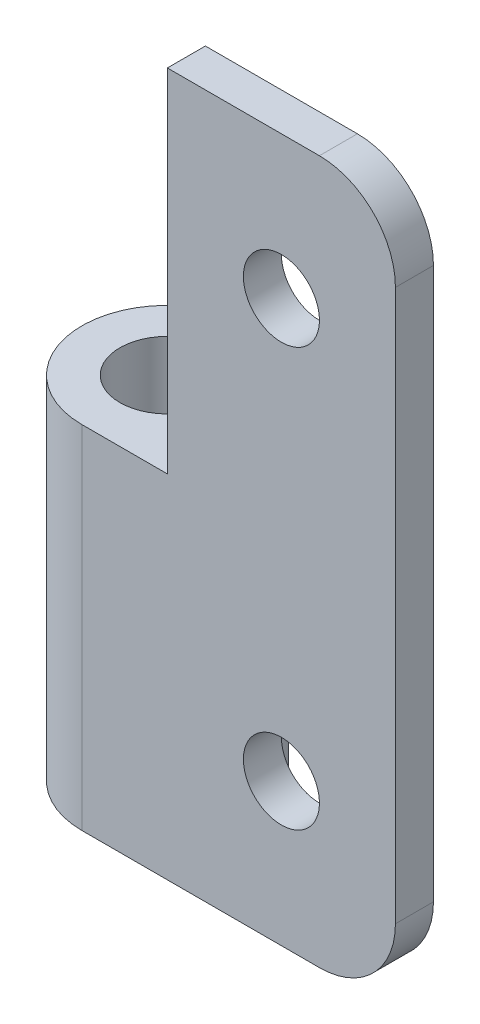
ISO-10303-21;
HEADER;
FILE_DESCRIPTION(('STEP AP214'),'2;1');
FILE_NAME('part.step','',(''),(''),'','','');
FILE_SCHEMA(('AUTOMOTIVE_DESIGN { 1 0 10303 214 1 1 1 1 }'));
ENDSEC;
DATA;
#1=APPLICATION_CONTEXT('core data for automotive mechanical design processes');
#2=APPLICATION_PROTOCOL_DEFINITION('international standard','automotive_design',2000,#1);
#3=PRODUCT_CONTEXT('',#1,'mechanical');
#4=PRODUCT('Part','Part','',(#3));
#5=PRODUCT_RELATED_PRODUCT_CATEGORY('part','',(#4));
#6=PRODUCT_DEFINITION_FORMATION('','',#4);
#7=PRODUCT_DEFINITION_CONTEXT('part definition',#1,'design');
#8=PRODUCT_DEFINITION('design','',#6,#7);
#9=PRODUCT_DEFINITION_SHAPE('','',#8);
#10=(LENGTH_UNIT() NAMED_UNIT(*) SI_UNIT(.MILLI.,.METRE.));
#11=(NAMED_UNIT(*) PLANE_ANGLE_UNIT() SI_UNIT($,.RADIAN.));
#12=(NAMED_UNIT(*) SI_UNIT($,.STERADIAN.) SOLID_ANGLE_UNIT());
#13=UNCERTAINTY_MEASURE_WITH_UNIT(LENGTH_MEASURE(1.E-05),#10,'distance_accuracy_value','');
#14=(GEOMETRIC_REPRESENTATION_CONTEXT(3) GLOBAL_UNCERTAINTY_ASSIGNED_CONTEXT((#13)) GLOBAL_UNIT_ASSIGNED_CONTEXT((#10,
#11,#12)) REPRESENTATION_CONTEXT('',''));
#15=CARTESIAN_POINT('',(0.,0.,0.));
#16=DIRECTION('',(0.,0.,1.));
#17=DIRECTION('',(1.,0.,0.));
#18=AXIS2_PLACEMENT_3D('',#15,#16,#17);
#19=CARTESIAN_POINT('',(0.,18.5,0.));
#20=DIRECTION('',(0.,1.,0.));
#21=DIRECTION('',(0.,0.,1.));
#22=AXIS2_PLACEMENT_3D('',#19,#20,#21);
#23=PLANE('',#22);
#24=DIRECTION('',(0.,0.,1.));
#25=VECTOR('',#24,1.);
#26=CARTESIAN_POINT('',(4.5,18.5,2.5));
#27=LINE('',#26,#25);
#28=CARTESIAN_POINT('',(4.5,18.5,2.5));
#29=VERTEX_POINT('',#28);
#30=CARTESIAN_POINT('',(4.5,18.5,4.5));
#31=VERTEX_POINT('',#30);
#32=EDGE_CURVE('E109',#29,#31,#27,.T.);
#33=ORIENTED_EDGE('',*,*,#32,.F.);
#34=DIRECTION('',(-1.,0.,0.));
#35=VECTOR('',#34,1.);
#36=CARTESIAN_POINT('',(16.5,18.5,2.5));
#37=LINE('',#36,#35);
#38=CARTESIAN_POINT('',(3.74165738677394,18.5,2.5));
#39=VERTEX_POINT('',#38);
#40=EDGE_CURVE('E116',#29,#39,#37,.T.);
#41=ORIENTED_EDGE('',*,*,#40,.T.);
#42=CARTESIAN_POINT('',(0.,18.5,0.));
#43=DIRECTION('',(0.,1.,0.));
#44=DIRECTION('',(0.,0.,1.));
#45=AXIS2_PLACEMENT_3D('',#42,#43,#44);
#46=CIRCLE('',#45,4.5);
#47=CARTESIAN_POINT('',(0.,18.5,4.5));
#48=VERTEX_POINT('',#47);
#49=EDGE_CURVE('E139',#39,#48,#46,.T.);
#50=ORIENTED_EDGE('',*,*,#49,.T.);
#51=DIRECTION('',(1.,0.,0.));
#52=VECTOR('',#51,1.);
#53=CARTESIAN_POINT('',(0.,18.5,4.5));
#54=LINE('',#53,#52);
#55=EDGE_CURVE('E142',#48,#31,#54,.T.);
#56=ORIENTED_EDGE('',*,*,#55,.T.);
#57=EDGE_LOOP('',(#33,#41,#50,#56));
#58=FACE_BOUND('',#57,.T.);
#59=CARTESIAN_POINT('',(0.,18.5,0.));
#60=DIRECTION('',(0.,1.,0.));
#61=DIRECTION('',(0.,0.,1.));
#62=AXIS2_PLACEMENT_3D('',#59,#60,#61);
#63=CIRCLE('',#62,2.5);
#64=CARTESIAN_POINT('',(0.,18.5,2.5));
#65=VERTEX_POINT('',#64);
#66=EDGE_CURVE('E133',#65,#65,#63,.T.);
#67=ORIENTED_EDGE('',*,*,#66,.F.);
#68=EDGE_LOOP('',(#67));
#69=FACE_BOUND('',#68,.T.);
#70=ADVANCED_FACE('F34',(#58,#69),#23,.T.);
#71=CARTESIAN_POINT('',(0.,0.,0.));
#72=DIRECTION('',(0.,1.,0.));
#73=DIRECTION('',(0.,0.,1.));
#74=AXIS2_PLACEMENT_3D('',#71,#72,#73);
#75=PLANE('',#74);
#76=DIRECTION('',(-1.,0.,0.));
#77=VECTOR('',#76,1.);
#78=CARTESIAN_POINT('',(16.5,0.,2.5));
#79=LINE('',#78,#77);
#80=CARTESIAN_POINT('',(12.5,0.,2.5));
#81=VERTEX_POINT('',#80);
#82=CARTESIAN_POINT('',(3.74165738677394,0.,2.5));
#83=VERTEX_POINT('',#82);
#84=EDGE_CURVE('E143',#81,#83,#79,.T.);
#85=ORIENTED_EDGE('',*,*,#84,.F.);
#86=DIRECTION('',(0.,0.,-1.));
#87=VECTOR('',#86,1.);
#88=CARTESIAN_POINT('',(12.5,0.,0.));
#89=LINE('',#88,#87);
#90=CARTESIAN_POINT('',(12.5,0.,4.5));
#91=VERTEX_POINT('',#90);
#92=EDGE_CURVE('E11',#81,#91,#89,.F.);
#93=ORIENTED_EDGE('',*,*,#92,.T.);
#94=DIRECTION('',(1.,0.,0.));
#95=VECTOR('',#94,1.);
#96=CARTESIAN_POINT('',(0.,0.,4.5));
#97=LINE('',#96,#95);
#98=CARTESIAN_POINT('',(0.,0.,4.5));
#99=VERTEX_POINT('',#98);
#100=EDGE_CURVE('E149',#99,#91,#97,.T.);
#101=ORIENTED_EDGE('',*,*,#100,.F.);
#102=CARTESIAN_POINT('',(0.,0.,0.));
#103=DIRECTION('',(0.,1.,0.));
#104=DIRECTION('',(0.,0.,1.));
#105=AXIS2_PLACEMENT_3D('',#102,#103,#104);
#106=CIRCLE('',#105,4.5);
#107=EDGE_CURVE('E136',#83,#99,#106,.T.);
#108=ORIENTED_EDGE('',*,*,#107,.F.);
#109=EDGE_LOOP('',(#85,#93,#101,#108));
#110=FACE_BOUND('',#109,.T.);
#111=CARTESIAN_POINT('',(0.,0.,0.));
#112=DIRECTION('',(0.,1.,0.));
#113=DIRECTION('',(0.,0.,1.));
#114=AXIS2_PLACEMENT_3D('',#111,#112,#113);
#115=CIRCLE('',#114,2.5);
#116=CARTESIAN_POINT('',(0.,0.,2.5));
#117=VERTEX_POINT('',#116);
#118=EDGE_CURVE('E119',#117,#117,#115,.T.);
#119=ORIENTED_EDGE('',*,*,#118,.T.);
#120=EDGE_LOOP('',(#119));
#121=FACE_BOUND('',#120,.T.);
#122=ADVANCED_FACE('F183',(#110,#121),#75,.F.);
#123=CARTESIAN_POINT('',(0.,18.5,0.));
#124=DIRECTION('',(0.,-1.,0.));
#125=DIRECTION('',(0.,0.,-1.));
#126=AXIS2_PLACEMENT_3D('',#123,#124,#125);
#127=CYLINDRICAL_SURFACE('',#126,4.5);
#128=ORIENTED_EDGE('',*,*,#107,.T.);
#129=DIRECTION('',(0.,-1.,0.));
#130=VECTOR('',#129,1.);
#131=CARTESIAN_POINT('',(0.,18.5,4.5));
#132=LINE('',#131,#130);
#133=EDGE_CURVE('E159',#48,#99,#132,.T.);
#134=ORIENTED_EDGE('',*,*,#133,.F.);
#135=ORIENTED_EDGE('',*,*,#49,.F.);
#136=DIRECTION('',(0.,-1.,0.));
#137=VECTOR('',#136,1.);
#138=CARTESIAN_POINT('',(3.74165738677394,18.5,2.5));
#139=LINE('',#138,#137);
#140=EDGE_CURVE('E146',#39,#83,#139,.T.);
#141=ORIENTED_EDGE('',*,*,#140,.T.);
#142=EDGE_LOOP('',(#128,#134,#135,#141));
#143=FACE_BOUND('',#142,.T.);
#144=ADVANCED_FACE('F187',(#143),#127,.T.);
#145=CARTESIAN_POINT('',(0.,18.5,4.5));
#146=DIRECTION('',(0.,0.,-1.));
#147=DIRECTION('',(-1.,0.,0.));
#148=AXIS2_PLACEMENT_3D('',#145,#146,#147);
#149=PLANE('',#148);
#150=CARTESIAN_POINT('',(10.5,7.5,4.5));
#151=DIRECTION('',(0.,0.,-1.));
#152=DIRECTION('',(-1.,0.,0.));
#153=AXIS2_PLACEMENT_3D('',#150,#151,#152);
#154=CIRCLE('',#153,2.);
#155=CARTESIAN_POINT('',(8.5,7.5,4.5));
#156=VERTEX_POINT('',#155);
#157=EDGE_CURVE('E131',#156,#156,#154,.F.);
#158=ORIENTED_EDGE('',*,*,#157,.F.);
#159=EDGE_LOOP('',(#158));
#160=FACE_BOUND('',#159,.T.);
#161=CARTESIAN_POINT('',(10.5,29.5,4.5));
#162=DIRECTION('',(0.,0.,-1.));
#163=DIRECTION('',(-1.,0.,0.));
#164=AXIS2_PLACEMENT_3D('',#161,#162,#163);
#165=CIRCLE('',#164,2.);
#166=CARTESIAN_POINT('',(8.5,29.5,4.5));
#167=VERTEX_POINT('',#166);
#168=EDGE_CURVE('E320',#167,#167,#165,.F.);
#169=ORIENTED_EDGE('',*,*,#168,.F.);
#170=EDGE_LOOP('',(#169));
#171=FACE_BOUND('',#170,.T.);
#172=DIRECTION('',(0.,-1.,0.));
#173=VECTOR('',#172,1.);
#174=CARTESIAN_POINT('',(16.5,18.5,4.5));
#175=LINE('',#174,#173);
#176=CARTESIAN_POINT('',(16.5,33.,4.5));
#177=VERTEX_POINT('',#176);
#178=CARTESIAN_POINT('',(16.5,4.,4.5));
#179=VERTEX_POINT('',#178);
#180=EDGE_CURVE('E157',#177,#179,#175,.T.);
#181=ORIENTED_EDGE('',*,*,#180,.F.);
#182=CARTESIAN_POINT('',(12.5,33.,4.5));
#183=DIRECTION('',(0.,0.,-1.));
#184=DIRECTION('',(-1.,0.,0.));
#185=AXIS2_PLACEMENT_3D('',#182,#183,#184);
#186=CIRCLE('',#185,4.);
#187=CARTESIAN_POINT('',(12.5,37.,4.5));
#188=VERTEX_POINT('',#187);
#189=EDGE_CURVE('E42',#177,#188,#186,.F.);
#190=ORIENTED_EDGE('',*,*,#189,.T.);
#191=DIRECTION('',(1.,0.,0.));
#192=VECTOR('',#191,1.);
#193=CARTESIAN_POINT('',(16.5,37.,4.5));
#194=LINE('',#193,#192);
#195=CARTESIAN_POINT('',(4.5,37.,4.5));
#196=VERTEX_POINT('',#195);
#197=EDGE_CURVE('E125',#196,#188,#194,.T.);
#198=ORIENTED_EDGE('',*,*,#197,.F.);
#199=DIRECTION('',(0.,-1.,0.));
#200=VECTOR('',#199,1.);
#201=CARTESIAN_POINT('',(4.5,37.,4.5));
#202=LINE('',#201,#200);
#203=EDGE_CURVE('E120',#196,#31,#202,.T.);
#204=ORIENTED_EDGE('',*,*,#203,.T.);
#205=ORIENTED_EDGE('',*,*,#55,.F.);
#206=ORIENTED_EDGE('',*,*,#133,.T.);
#207=ORIENTED_EDGE('',*,*,#100,.T.);
#208=CARTESIAN_POINT('',(12.5,4.,4.5));
#209=DIRECTION('',(0.,0.,-1.));
#210=DIRECTION('',(-1.,0.,0.));
#211=AXIS2_PLACEMENT_3D('',#208,#209,#210);
#212=CIRCLE('',#211,4.);
#213=EDGE_CURVE('E54',#91,#179,#212,.F.);
#214=ORIENTED_EDGE('',*,*,#213,.T.);
#215=EDGE_LOOP('',(#181,#190,#198,#204,#205,#206,#207,#214));
#216=FACE_BOUND('',#215,.T.);
#217=ADVANCED_FACE('F173',(#160,#171,#216),#149,.F.);
#218=CARTESIAN_POINT('',(16.5,18.5,4.5));
#219=DIRECTION('',(-1.,0.,0.));
#220=DIRECTION('',(0.,0.,1.));
#221=AXIS2_PLACEMENT_3D('',#218,#219,#220);
#222=PLANE('',#221);
#223=DIRECTION('',(0.,-1.,0.));
#224=VECTOR('',#223,1.);
#225=CARTESIAN_POINT('',(16.5,18.5,2.5));
#226=LINE('',#225,#224);
#227=CARTESIAN_POINT('',(16.5,33.,2.5));
#228=VERTEX_POINT('',#227);
#229=CARTESIAN_POINT('',(16.5,4.,2.5));
#230=VERTEX_POINT('',#229);
#231=EDGE_CURVE('E154',#228,#230,#226,.T.);
#232=ORIENTED_EDGE('',*,*,#231,.F.);
#233=DIRECTION('',(0.,0.,-1.));
#234=VECTOR('',#233,1.);
#235=CARTESIAN_POINT('',(16.5,33.,4.5));
#236=LINE('',#235,#234);
#237=EDGE_CURVE('E170',#228,#177,#236,.F.);
#238=ORIENTED_EDGE('',*,*,#237,.T.);
#239=ORIENTED_EDGE('',*,*,#180,.T.);
#240=DIRECTION('',(0.,0.,-1.));
#241=VECTOR('',#240,1.);
#242=CARTESIAN_POINT('',(16.5,4.,4.5));
#243=LINE('',#242,#241);
#244=EDGE_CURVE('E167',#179,#230,#243,.T.);
#245=ORIENTED_EDGE('',*,*,#244,.T.);
#246=EDGE_LOOP('',(#232,#238,#239,#245));
#247=FACE_BOUND('',#246,.T.);
#248=ADVANCED_FACE('F179',(#247),#222,.F.);
#249=CARTESIAN_POINT('',(16.5,18.5,2.5));
#250=DIRECTION('',(0.,0.,1.));
#251=DIRECTION('',(1.,0.,0.));
#252=AXIS2_PLACEMENT_3D('',#249,#250,#251);
#253=PLANE('',#252);
#254=CARTESIAN_POINT('',(10.5,7.5,2.5));
#255=DIRECTION('',(0.,0.,-1.));
#256=DIRECTION('',(-1.,0.,0.));
#257=AXIS2_PLACEMENT_3D('',#254,#255,#256);
#258=CIRCLE('',#257,2.);
#259=CARTESIAN_POINT('',(8.5,7.5,2.5));
#260=VERTEX_POINT('',#259);
#261=EDGE_CURVE('E316',#260,#260,#258,.T.);
#262=ORIENTED_EDGE('',*,*,#261,.F.);
#263=EDGE_LOOP('',(#262));
#264=FACE_BOUND('',#263,.T.);
#265=CARTESIAN_POINT('',(10.5,29.5,2.5));
#266=DIRECTION('',(0.,0.,-1.));
#267=DIRECTION('',(1.,0.,0.));
#268=AXIS2_PLACEMENT_3D('',#265,#266,#267);
#269=CIRCLE('',#268,2.);
#270=CARTESIAN_POINT('',(12.5,29.5,2.5));
#271=VERTEX_POINT('',#270);
#272=EDGE_CURVE('E323',#271,#271,#269,.T.);
#273=ORIENTED_EDGE('',*,*,#272,.F.);
#274=EDGE_LOOP('',(#273));
#275=FACE_BOUND('',#274,.T.);
#276=DIRECTION('',(-1.,0.,0.));
#277=VECTOR('',#276,1.);
#278=CARTESIAN_POINT('',(16.5,37.,2.5));
#279=LINE('',#278,#277);
#280=CARTESIAN_POINT('',(12.5,37.,2.5));
#281=VERTEX_POINT('',#280);
#282=CARTESIAN_POINT('',(4.5,37.,2.5));
#283=VERTEX_POINT('',#282);
#284=EDGE_CURVE('E99',#281,#283,#279,.T.);
#285=ORIENTED_EDGE('',*,*,#284,.F.);
#286=CARTESIAN_POINT('',(12.5,33.,2.5));
#287=DIRECTION('',(0.,0.,1.));
#288=DIRECTION('',(1.,0.,0.));
#289=AXIS2_PLACEMENT_3D('',#286,#287,#288);
#290=CIRCLE('',#289,4.);
#291=EDGE_CURVE('E165',#281,#228,#290,.F.);
#292=ORIENTED_EDGE('',*,*,#291,.T.);
#293=ORIENTED_EDGE('',*,*,#231,.T.);
#294=CARTESIAN_POINT('',(12.5,4.,2.5));
#295=DIRECTION('',(0.,0.,1.));
#296=DIRECTION('',(1.,0.,0.));
#297=AXIS2_PLACEMENT_3D('',#294,#295,#296);
#298=CIRCLE('',#297,4.);
#299=EDGE_CURVE('E163',#230,#81,#298,.F.);
#300=ORIENTED_EDGE('',*,*,#299,.T.);
#301=ORIENTED_EDGE('',*,*,#84,.T.);
#302=ORIENTED_EDGE('',*,*,#140,.F.);
#303=ORIENTED_EDGE('',*,*,#40,.F.);
#304=DIRECTION('',(0.,-1.,0.));
#305=VECTOR('',#304,1.);
#306=CARTESIAN_POINT('',(4.5,37.,2.5));
#307=LINE('',#306,#305);
#308=EDGE_CURVE('E113',#283,#29,#307,.T.);
#309=ORIENTED_EDGE('',*,*,#308,.F.);
#310=EDGE_LOOP('',(#285,#292,#293,#300,#301,#302,#303,#309));
#311=FACE_BOUND('',#310,.T.);
#312=ADVANCED_FACE('F114',(#264,#275,#311),#253,.F.);
#313=CARTESIAN_POINT('',(0.,18.5,0.));
#314=DIRECTION('',(0.,-1.,0.));
#315=DIRECTION('',(0.,0.,-1.));
#316=AXIS2_PLACEMENT_3D('',#313,#314,#315);
#317=CYLINDRICAL_SURFACE('',#316,2.5);
#318=ORIENTED_EDGE('',*,*,#66,.T.);
#319=EDGE_LOOP('',(#318));
#320=FACE_BOUND('',#319,.T.);
#321=ORIENTED_EDGE('',*,*,#118,.F.);
#322=EDGE_LOOP('',(#321));
#323=FACE_BOUND('',#322,.T.);
#324=ADVANCED_FACE('F195',(#320,#323),#317,.F.);
#325=CARTESIAN_POINT('',(4.5,37.,2.5));
#326=DIRECTION('',(1.,0.,0.));
#327=DIRECTION('',(0.,0.,-1.));
#328=AXIS2_PLACEMENT_3D('',#325,#326,#327);
#329=PLANE('',#328);
#330=ORIENTED_EDGE('',*,*,#32,.T.);
#331=ORIENTED_EDGE('',*,*,#203,.F.);
#332=DIRECTION('',(0.,0.,1.));
#333=VECTOR('',#332,1.);
#334=CARTESIAN_POINT('',(4.5,37.,2.5));
#335=LINE('',#334,#333);
#336=EDGE_CURVE('E104',#283,#196,#335,.T.);
#337=ORIENTED_EDGE('',*,*,#336,.F.);
#338=ORIENTED_EDGE('',*,*,#308,.T.);
#339=EDGE_LOOP('',(#330,#331,#337,#338));
#340=FACE_BOUND('',#339,.T.);
#341=ADVANCED_FACE('F122',(#340),#329,.F.);
#342=CARTESIAN_POINT('',(0.,37.,0.));
#343=DIRECTION('',(0.,-1.,0.));
#344=DIRECTION('',(0.,0.,-1.));
#345=AXIS2_PLACEMENT_3D('',#342,#343,#344);
#346=PLANE('',#345);
#347=ORIENTED_EDGE('',*,*,#197,.T.);
#348=DIRECTION('',(0.,0.,-1.));
#349=VECTOR('',#348,1.);
#350=CARTESIAN_POINT('',(12.5,37.,0.));
#351=LINE('',#350,#349);
#352=EDGE_CURVE('E107',#188,#281,#351,.T.);
#353=ORIENTED_EDGE('',*,*,#352,.T.);
#354=ORIENTED_EDGE('',*,*,#284,.T.);
#355=ORIENTED_EDGE('',*,*,#336,.T.);
#356=EDGE_LOOP('',(#347,#353,#354,#355));
#357=FACE_BOUND('',#356,.T.);
#358=ADVANCED_FACE('F102',(#357),#346,.F.);
#359=CARTESIAN_POINT('',(10.5,29.5,4.501));
#360=DIRECTION('',(0.,0.,-1.));
#361=DIRECTION('',(-1.,0.,0.));
#362=AXIS2_PLACEMENT_3D('',#359,#360,#361);
#363=CYLINDRICAL_SURFACE('',#362,2.);
#364=ORIENTED_EDGE('',*,*,#272,.T.);
#365=EDGE_LOOP('',(#364));
#366=FACE_BOUND('',#365,.T.);
#367=ORIENTED_EDGE('',*,*,#168,.T.);
#368=EDGE_LOOP('',(#367));
#369=FACE_BOUND('',#368,.T.);
#370=ADVANCED_FACE('F220',(#366,#369),#363,.F.);
#371=CARTESIAN_POINT('',(10.5,7.5,4.501));
#372=DIRECTION('',(0.,0.,-1.));
#373=DIRECTION('',(-1.,0.,0.));
#374=AXIS2_PLACEMENT_3D('',#371,#372,#373);
#375=CYLINDRICAL_SURFACE('',#374,2.);
#376=ORIENTED_EDGE('',*,*,#261,.T.);
#377=EDGE_LOOP('',(#376));
#378=FACE_BOUND('',#377,.T.);
#379=ORIENTED_EDGE('',*,*,#157,.T.);
#380=EDGE_LOOP('',(#379));
#381=FACE_BOUND('',#380,.T.);
#382=ADVANCED_FACE('F215',(#378,#381),#375,.F.);
#383=CARTESIAN_POINT('',(12.5,33.,0.));
#384=DIRECTION('',(0.,0.,-1.));
#385=DIRECTION('',(-1.,0.,0.));
#386=AXIS2_PLACEMENT_3D('',#383,#384,#385);
#387=CYLINDRICAL_SURFACE('',#386,4.);
#388=ORIENTED_EDGE('',*,*,#189,.F.);
#389=ORIENTED_EDGE('',*,*,#237,.F.);
#390=ORIENTED_EDGE('',*,*,#291,.F.);
#391=ORIENTED_EDGE('',*,*,#352,.F.);
#392=EDGE_LOOP('',(#388,#389,#390,#391));
#393=FACE_BOUND('',#392,.T.);
#394=ADVANCED_FACE('F176',(#393),#387,.T.);
#395=CARTESIAN_POINT('',(12.5,4.,4.5));
#396=DIRECTION('',(0.,0.,-1.));
#397=DIRECTION('',(-1.,0.,0.));
#398=AXIS2_PLACEMENT_3D('',#395,#396,#397);
#399=CYLINDRICAL_SURFACE('',#398,4.);
#400=ORIENTED_EDGE('',*,*,#213,.F.);
#401=ORIENTED_EDGE('',*,*,#92,.F.);
#402=ORIENTED_EDGE('',*,*,#299,.F.);
#403=ORIENTED_EDGE('',*,*,#244,.F.);
#404=EDGE_LOOP('',(#400,#401,#402,#403));
#405=FACE_BOUND('',#404,.T.);
#406=ADVANCED_FACE('F36',(#405),#399,.T.);
#407=CLOSED_SHELL('',(#70,#122,#144,#217,#248,#312,#324,#341,#358,#370,#382,#394,#406));
#408=MANIFOLD_SOLID_BREP('B2',#407);
#409=ADVANCED_BREP_SHAPE_REPRESENTATION('',(#18,#408),#14);
#410=SHAPE_DEFINITION_REPRESENTATION(#9,#409);
ENDSEC;
END-ISO-10303-21;
